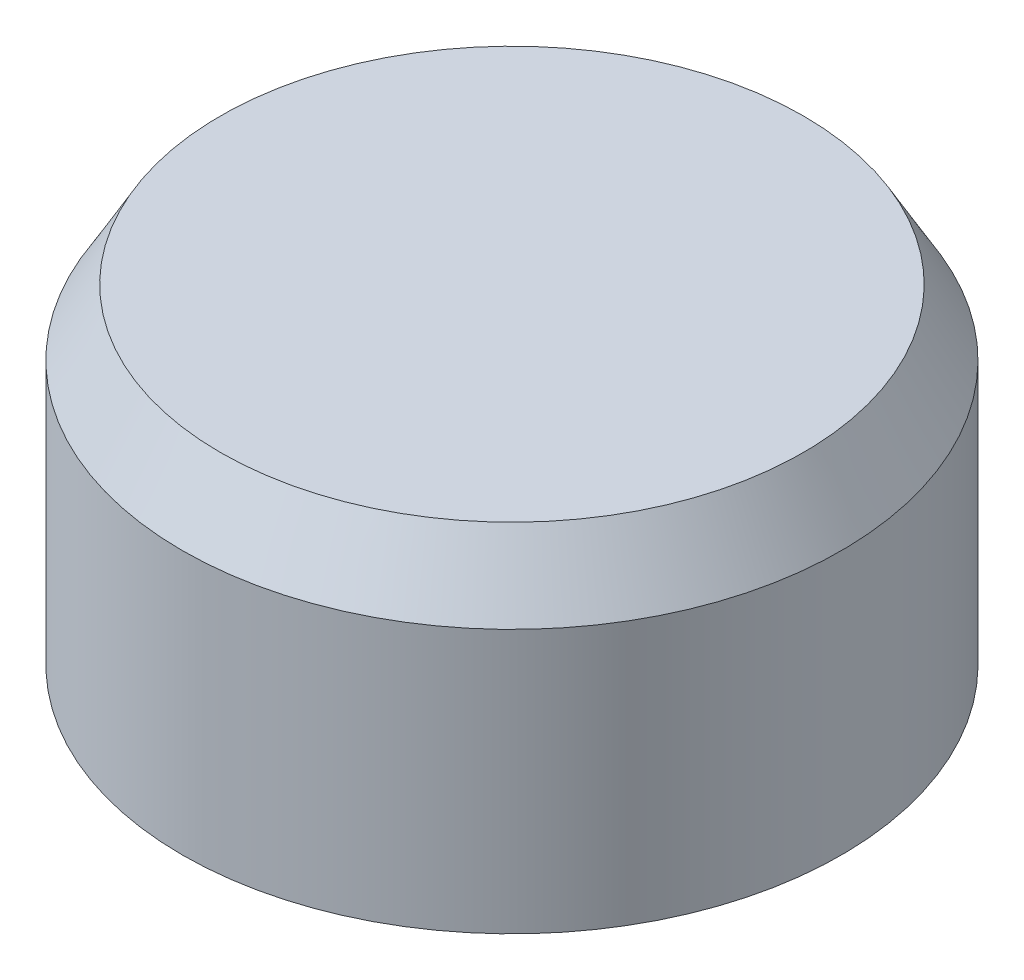
ISO-10303-21;
HEADER;
FILE_DESCRIPTION(('STEP AP214'),'2;1');
FILE_NAME('part.step','',(''),(''),'','','');
FILE_SCHEMA(('AUTOMOTIVE_DESIGN { 1 0 10303 214 1 1 1 1 }'));
ENDSEC;
DATA;
#1=APPLICATION_CONTEXT('core data for automotive mechanical design processes');
#2=APPLICATION_PROTOCOL_DEFINITION('international standard','automotive_design',2000,#1);
#3=PRODUCT_CONTEXT('',#1,'mechanical');
#4=PRODUCT('Part','Part','',(#3));
#5=PRODUCT_RELATED_PRODUCT_CATEGORY('part','',(#4));
#6=PRODUCT_DEFINITION_FORMATION('','',#4);
#7=PRODUCT_DEFINITION_CONTEXT('part definition',#1,'design');
#8=PRODUCT_DEFINITION('design','',#6,#7);
#9=PRODUCT_DEFINITION_SHAPE('','',#8);
#10=(LENGTH_UNIT() NAMED_UNIT(*) SI_UNIT(.MILLI.,.METRE.));
#11=(NAMED_UNIT(*) PLANE_ANGLE_UNIT() SI_UNIT($,.RADIAN.));
#12=(NAMED_UNIT(*) SI_UNIT($,.STERADIAN.) SOLID_ANGLE_UNIT());
#13=UNCERTAINTY_MEASURE_WITH_UNIT(LENGTH_MEASURE(1.E-05),#10,'distance_accuracy_value','');
#14=(GEOMETRIC_REPRESENTATION_CONTEXT(3) GLOBAL_UNCERTAINTY_ASSIGNED_CONTEXT((#13)) GLOBAL_UNIT_ASSIGNED_CONTEXT((#10,
#11,#12)) REPRESENTATION_CONTEXT('',''));
#15=CARTESIAN_POINT('',(0.,0.,0.));
#16=DIRECTION('',(0.,0.,1.));
#17=DIRECTION('',(1.,0.,0.));
#18=AXIS2_PLACEMENT_3D('',#15,#16,#17);
#19=CARTESIAN_POINT('',(0.,0.,0.));
#20=DIRECTION('',(0.,1.,0.));
#21=DIRECTION('',(0.,0.,1.));
#22=AXIS2_PLACEMENT_3D('',#19,#20,#21);
#23=PLANE('',#22);
#24=CARTESIAN_POINT('',(0.,0.,0.));
#25=DIRECTION('',(0.,1.,0.));
#26=DIRECTION('',(0.,0.,1.));
#27=AXIS2_PLACEMENT_3D('',#24,#25,#26);
#28=CIRCLE('',#27,10.);
#29=CARTESIAN_POINT('',(0.,0.,10.));
#30=VERTEX_POINT('',#29);
#31=EDGE_CURVE('E83',#30,#30,#28,.T.);
#32=ORIENTED_EDGE('',*,*,#31,.F.);
#33=EDGE_LOOP('',(#32));
#34=FACE_BOUND('',#33,.T.);
#35=CARTESIAN_POINT('',(0.,0.,0.));
#36=DIRECTION('',(0.,1.,0.));
#37=DIRECTION('',(0.,0.,1.));
#38=AXIS2_PLACEMENT_3D('',#35,#36,#37);
#39=CIRCLE('',#38,2.5);
#40=CARTESIAN_POINT('',(2.,0.,1.5));
#41=VERTEX_POINT('',#40);
#42=CARTESIAN_POINT('',(-2.,0.,1.5));
#43=VERTEX_POINT('',#42);
#44=EDGE_CURVE('E58',#41,#43,#39,.T.);
#45=ORIENTED_EDGE('',*,*,#44,.T.);
#46=DIRECTION('',(1.,0.,0.));
#47=VECTOR('',#46,1.);
#48=CARTESIAN_POINT('',(-2.,0.,1.5));
#49=LINE('',#48,#47);
#50=EDGE_CURVE('E71',#43,#41,#49,.T.);
#51=ORIENTED_EDGE('',*,*,#50,.T.);
#52=EDGE_LOOP('',(#45,#51));
#53=FACE_BOUND('',#52,.T.);
#54=ADVANCED_FACE('F41',(#34,#53),#23,.F.);
#55=CARTESIAN_POINT('',(0.,10.,0.));
#56=DIRECTION('',(0.,-1.,0.));
#57=DIRECTION('',(0.,0.,-1.));
#58=AXIS2_PLACEMENT_3D('',#55,#56,#57);
#59=CYLINDRICAL_SURFACE('',#58,10.);
#60=CARTESIAN_POINT('',(0.,7.99999999999998,0.));
#61=DIRECTION('',(0.,1.,0.));
#62=DIRECTION('',(0.,0.,1.));
#63=AXIS2_PLACEMENT_3D('',#60,#61,#62);
#64=CIRCLE('',#63,10.);
#65=CARTESIAN_POINT('',(0.,7.99999999999998,10.));
#66=VERTEX_POINT('',#65);
#67=EDGE_CURVE('E11',#66,#66,#64,.F.);
#68=ORIENTED_EDGE('',*,*,#67,.T.);
#69=EDGE_LOOP('',(#68));
#70=FACE_BOUND('',#69,.T.);
#71=ORIENTED_EDGE('',*,*,#31,.T.);
#72=EDGE_LOOP('',(#71));
#73=FACE_BOUND('',#72,.T.);
#74=ADVANCED_FACE('F110',(#70,#73),#59,.T.);
#75=CARTESIAN_POINT('',(0.,10.,0.));
#76=DIRECTION('',(0.,1.,0.));
#77=DIRECTION('',(0.,0.,1.));
#78=AXIS2_PLACEMENT_3D('',#75,#76,#77);
#79=PLANE('',#78);
#80=CARTESIAN_POINT('',(0.,10.,0.));
#81=DIRECTION('',(0.,1.,0.));
#82=DIRECTION('',(0.,0.,1.));
#83=AXIS2_PLACEMENT_3D('',#80,#81,#82);
#84=CIRCLE('',#83,8.84529946162074);
#85=CARTESIAN_POINT('',(0.,10.,8.84529946162074));
#86=VERTEX_POINT('',#85);
#87=EDGE_CURVE('E51',#86,#86,#84,.T.);
#88=ORIENTED_EDGE('',*,*,#87,.T.);
#89=EDGE_LOOP('',(#88));
#90=FACE_BOUND('',#89,.T.);
#91=ADVANCED_FACE('F98',(#90),#79,.T.);
#92=CARTESIAN_POINT('',(0.,5.,0.));
#93=DIRECTION('',(0.,-1.,0.));
#94=DIRECTION('',(0.,0.,-1.));
#95=AXIS2_PLACEMENT_3D('',#92,#93,#94);
#96=CYLINDRICAL_SURFACE('',#95,2.5);
#97=ORIENTED_EDGE('',*,*,#44,.F.);
#98=DIRECTION('',(0.,-1.,0.));
#99=VECTOR('',#98,1.);
#100=CARTESIAN_POINT('',(2.,5.,1.5));
#101=LINE('',#100,#99);
#102=CARTESIAN_POINT('',(2.,5.,1.5));
#103=VERTEX_POINT('',#102);
#104=EDGE_CURVE('E74',#103,#41,#101,.T.);
#105=ORIENTED_EDGE('',*,*,#104,.F.);
#106=CARTESIAN_POINT('',(0.,5.,0.));
#107=DIRECTION('',(0.,1.,0.));
#108=DIRECTION('',(0.,0.,1.));
#109=AXIS2_PLACEMENT_3D('',#106,#107,#108);
#110=CIRCLE('',#109,2.5);
#111=CARTESIAN_POINT('',(-2.,5.,1.5));
#112=VERTEX_POINT('',#111);
#113=EDGE_CURVE('E77',#103,#112,#110,.T.);
#114=ORIENTED_EDGE('',*,*,#113,.T.);
#115=DIRECTION('',(0.,-1.,0.));
#116=VECTOR('',#115,1.);
#117=CARTESIAN_POINT('',(-2.,5.,1.5));
#118=LINE('',#117,#116);
#119=EDGE_CURVE('E73',#112,#43,#118,.T.);
#120=ORIENTED_EDGE('',*,*,#119,.T.);
#121=EDGE_LOOP('',(#97,#105,#114,#120));
#122=FACE_BOUND('',#121,.T.);
#123=ADVANCED_FACE('F80',(#122),#96,.F.);
#124=CARTESIAN_POINT('',(-2.,5.,1.5));
#125=DIRECTION('',(0.,0.,-1.));
#126=DIRECTION('',(-1.,0.,0.));
#127=AXIS2_PLACEMENT_3D('',#124,#125,#126);
#128=PLANE('',#127);
#129=ORIENTED_EDGE('',*,*,#50,.F.);
#130=ORIENTED_EDGE('',*,*,#119,.F.);
#131=DIRECTION('',(1.,0.,0.));
#132=VECTOR('',#131,1.);
#133=CARTESIAN_POINT('',(-2.,5.,1.5));
#134=LINE('',#133,#132);
#135=EDGE_CURVE('E66',#112,#103,#134,.T.);
#136=ORIENTED_EDGE('',*,*,#135,.T.);
#137=ORIENTED_EDGE('',*,*,#104,.T.);
#138=EDGE_LOOP('',(#129,#130,#136,#137));
#139=FACE_BOUND('',#138,.T.);
#140=ADVANCED_FACE('F72',(#139),#128,.T.);
#141=CARTESIAN_POINT('',(0.,5.,0.));
#142=DIRECTION('',(0.,1.,0.));
#143=DIRECTION('',(0.,0.,1.));
#144=AXIS2_PLACEMENT_3D('',#141,#142,#143);
#145=PLANE('',#144);
#146=ORIENTED_EDGE('',*,*,#113,.F.);
#147=ORIENTED_EDGE('',*,*,#135,.F.);
#148=EDGE_LOOP('',(#146,#147));
#149=FACE_BOUND('',#148,.T.);
#150=ADVANCED_FACE('F101',(#149),#145,.F.);
#151=CARTESIAN_POINT('',(0.,10.,0.));
#152=DIRECTION('',(0.,-1.,0.));
#153=DIRECTION('',(0.,0.,-1.));
#154=AXIS2_PLACEMENT_3D('',#151,#152,#153);
#155=CONICAL_SURFACE('',#154,8.84529946162074,0.523598775598296);
#156=ORIENTED_EDGE('',*,*,#67,.F.);
#157=EDGE_LOOP('',(#156));
#158=FACE_BOUND('',#157,.T.);
#159=ORIENTED_EDGE('',*,*,#87,.F.);
#160=EDGE_LOOP('',(#159));
#161=FACE_BOUND('',#160,.T.);
#162=ADVANCED_FACE('F44',(#158,#161),#155,.T.);
#163=CLOSED_SHELL('',(#54,#74,#91,#123,#140,#150,#162));
#164=MANIFOLD_SOLID_BREP('B2',#163);
#165=ADVANCED_BREP_SHAPE_REPRESENTATION('',(#18,#164),#14);
#166=SHAPE_DEFINITION_REPRESENTATION(#9,#165);
ENDSEC;
END-ISO-10303-21;
